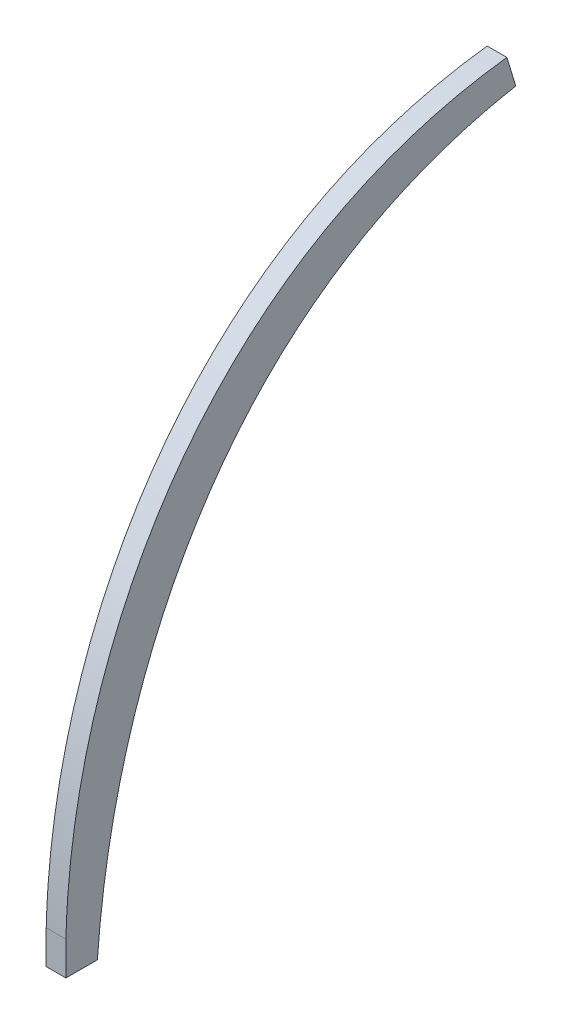
ISO-10303-21;
HEADER;
FILE_DESCRIPTION(('STEP AP214'),'2;1');
FILE_NAME('part.step','',(''),(''),'','','');
FILE_SCHEMA(('AUTOMOTIVE_DESIGN { 1 0 10303 214 1 1 1 1 }'));
ENDSEC;
DATA;
#1=APPLICATION_CONTEXT('core data for automotive mechanical design processes');
#2=APPLICATION_PROTOCOL_DEFINITION('international standard','automotive_design',2000,#1);
#3=PRODUCT_CONTEXT('',#1,'mechanical');
#4=PRODUCT('Part','Part','',(#3));
#5=PRODUCT_RELATED_PRODUCT_CATEGORY('part','',(#4));
#6=PRODUCT_DEFINITION_FORMATION('','',#4);
#7=PRODUCT_DEFINITION_CONTEXT('part definition',#1,'design');
#8=PRODUCT_DEFINITION('design','',#6,#7);
#9=PRODUCT_DEFINITION_SHAPE('','',#8);
#10=(LENGTH_UNIT() NAMED_UNIT(*) SI_UNIT(.MILLI.,.METRE.));
#11=(NAMED_UNIT(*) PLANE_ANGLE_UNIT() SI_UNIT($,.RADIAN.));
#12=(NAMED_UNIT(*) SI_UNIT($,.STERADIAN.) SOLID_ANGLE_UNIT());
#13=UNCERTAINTY_MEASURE_WITH_UNIT(LENGTH_MEASURE(1.E-05),#10,'distance_accuracy_value','');
#14=(GEOMETRIC_REPRESENTATION_CONTEXT(3) GLOBAL_UNCERTAINTY_ASSIGNED_CONTEXT((#13)) GLOBAL_UNIT_ASSIGNED_CONTEXT((#10,
#11,#12)) REPRESENTATION_CONTEXT('',''));
#15=CARTESIAN_POINT('',(0.,0.,0.));
#16=DIRECTION('',(0.,0.,1.));
#17=DIRECTION('',(1.,0.,0.));
#18=AXIS2_PLACEMENT_3D('',#15,#16,#17);
#19=CARTESIAN_POINT('',(4.7625,0.,0.));
#20=DIRECTION('',(1.,0.,0.));
#21=DIRECTION('',(0.,0.,-1.));
#22=AXIS2_PLACEMENT_3D('',#19,#20,#21);
#23=PLANE('',#22);
#24=DIRECTION('',(0.,-0.993368793467325,-0.114971475441832));
#25=VECTOR('',#24,1.);
#26=CARTESIAN_POINT('',(4.7625,139.617065558477,7.61887548022135));
#27=LINE('',#26,#25);
#28=CARTESIAN_POINT('',(4.76249999999993,139.553983208914,7.61157439440986));
#29=VERTEX_POINT('',#28);
#30=CARTESIAN_POINT('',(4.7625,139.490907721706,7.60427410284023));
#31=VERTEX_POINT('',#30);
#32=EDGE_CURVE('E204',#29,#31,#27,.T.);
#33=ORIENTED_EDGE('',*,*,#32,.F.);
#34=CARTESIAN_POINT('',(4.7625,139.7,6.35000000000001));
#35=CARTESIAN_POINT('',(4.7625,131.308423529726,81.9766327472276));
#36=CARTESIAN_POINT('',(4.7625,62.8398866248398,115.82979441628));
#37=CARTESIAN_POINT('',(4.7625,0.,114.3));
#38=B_SPLINE_CURVE_WITH_KNOTS('',3,(#34,#35,#36,#37),.UNSPECIFIED.,.F.,.F.,(4,4),(0.,1.),.UNSPECIFIED.);
#39=CARTESIAN_POINT('',(4.7625,8.15573963729927,114.3));
#40=VERTEX_POINT('',#39);
#41=EDGE_CURVE('E133',#29,#40,#38,.T.);
#42=ORIENTED_EDGE('',*,*,#41,.T.);
#43=DIRECTION('',(0.,-1.,0.));
#44=VECTOR('',#43,1.);
#45=CARTESIAN_POINT('',(4.7625,0.,114.3));
#46=LINE('',#45,#44);
#47=CARTESIAN_POINT('',(4.7625,0.,114.3));
#48=VERTEX_POINT('',#47);
#49=EDGE_CURVE('E130',#40,#48,#46,.T.);
#50=ORIENTED_EDGE('',*,*,#49,.T.);
#51=DIRECTION('',(0.,0.,-1.));
#52=VECTOR('',#51,1.);
#53=CARTESIAN_POINT('',(4.7625,0.,0.));
#54=LINE('',#53,#52);
#55=CARTESIAN_POINT('',(4.7625,0.,106.68));
#56=VERTEX_POINT('',#55);
#57=EDGE_CURVE('E117',#48,#56,#54,.T.);
#58=ORIENTED_EDGE('',*,*,#57,.T.);
#59=CARTESIAN_POINT('',(4.7625,0.,106.68));
#60=CARTESIAN_POINT('',(4.7625,59.703953955578,102.356668146879));
#61=CARTESIAN_POINT('',(4.7625,123.221068249147,72.6720266816524));
#62=CARTESIAN_POINT('',(4.7625,133.35,0.));
#63=B_SPLINE_CURVE_WITH_KNOTS('',3,(#59,#60,#61,#62),.UNSPECIFIED.,.F.,.F.,(4,4),(0.,1.),.UNSPECIFIED.);
#64=CARTESIAN_POINT('',(4.7625,132.474635760667,5.46100087783242));
#65=VERTEX_POINT('',#64);
#66=EDGE_CURVE('E105',#56,#65,#63,.T.);
#67=ORIENTED_EDGE('',*,*,#66,.T.);
#68=DIRECTION('',(0.,-0.956824587352856,-0.290665975024662));
#69=VECTOR('',#68,1.);
#70=CARTESIAN_POINT('',(4.7625,139.553986226189,7.61157836770352));
#71=LINE('',#70,#69);
#72=CARTESIAN_POINT('',(4.7625,139.492233521728,7.59281901485044));
#73=VERTEX_POINT('',#72);
#74=EDGE_CURVE('E55',#73,#65,#71,.T.);
#75=ORIENTED_EDGE('',*,*,#74,.F.);
#76=DIRECTION('',(0.,-0.114971475441836,0.993368793467324));
#77=VECTOR('',#76,1.);
#78=CARTESIAN_POINT('',(4.7625,139.636921081615,6.34269931130946));
#79=LINE('',#78,#77);
#80=EDGE_CURVE('E63',#73,#31,#79,.T.);
#81=ORIENTED_EDGE('',*,*,#80,.T.);
#82=EDGE_LOOP('',(#33,#42,#50,#58,#67,#75,#81));
#83=FACE_BOUND('',#82,.T.);
#84=ADVANCED_FACE('F38',(#83),#23,.T.);
#85=CARTESIAN_POINT('',(0.,0.,0.));
#86=DIRECTION('',(1.,0.,0.));
#87=DIRECTION('',(0.,0.,-1.));
#88=AXIS2_PLACEMENT_3D('',#85,#86,#87);
#89=PLANE('',#88);
#90=CARTESIAN_POINT('',(0.,139.7,6.35000000000001));
#91=CARTESIAN_POINT('',(0.,131.308423529726,81.9766327472276));
#92=CARTESIAN_POINT('',(0.,62.8398866248398,115.82979441628));
#93=CARTESIAN_POINT('',(0.,0.,114.3));
#94=B_SPLINE_CURVE_WITH_KNOTS('',3,(#90,#91,#92,#93),.UNSPECIFIED.,.F.,.F.,(4,4),(0.,1.),.UNSPECIFIED.);
#95=CARTESIAN_POINT('',(0.,139.553986226189,7.61157836770352));
#96=VERTEX_POINT('',#95);
#97=CARTESIAN_POINT('',(0.,8.15573963729927,114.3));
#98=VERTEX_POINT('',#97);
#99=EDGE_CURVE('E140',#96,#98,#94,.T.);
#100=ORIENTED_EDGE('',*,*,#99,.F.);
#101=DIRECTION('',(0.,-0.993368793467325,-0.114971475441832));
#102=VECTOR('',#101,1.);
#103=CARTESIAN_POINT('',(0.,139.617065144574,7.61887905639408));
#104=LINE('',#103,#102);
#105=CARTESIAN_POINT('',(0.,139.490907307804,7.60427767901297));
#106=VERTEX_POINT('',#105);
#107=EDGE_CURVE('E150',#96,#106,#104,.T.);
#108=ORIENTED_EDGE('',*,*,#107,.T.);
#109=DIRECTION('',(0.,0.114971475441832,-0.993368793467325));
#110=VECTOR('',#109,1.);
#111=CARTESIAN_POINT('',(0.,139.490907307804,7.60427767901297));
#112=LINE('',#111,#110);
#113=CARTESIAN_POINT('',(0.,139.492233521728,7.59281901485044));
#114=VERTEX_POINT('',#113);
#115=EDGE_CURVE('E199',#106,#114,#112,.T.);
#116=ORIENTED_EDGE('',*,*,#115,.T.);
#117=DIRECTION('',(0.,-0.956824587352856,-0.290665975024662));
#118=VECTOR('',#117,1.);
#119=CARTESIAN_POINT('',(0.,139.553986226189,7.61157836770352));
#120=LINE('',#119,#118);
#121=CARTESIAN_POINT('',(0.,132.474635920143,5.46099999999998));
#122=VERTEX_POINT('',#121);
#123=EDGE_CURVE('E116',#114,#122,#120,.T.);
#124=ORIENTED_EDGE('',*,*,#123,.T.);
#125=CARTESIAN_POINT('',(0.,0.,106.68));
#126=CARTESIAN_POINT('',(0.,59.703953955578,102.356668146879));
#127=CARTESIAN_POINT('',(0.,123.221068249147,72.6720266816524));
#128=CARTESIAN_POINT('',(0.,133.35,0.));
#129=B_SPLINE_CURVE_WITH_KNOTS('',3,(#125,#126,#127,#128),.UNSPECIFIED.,.F.,.F.,(4,4),(0.,1.),.UNSPECIFIED.);
#130=CARTESIAN_POINT('',(0.,0.,106.68));
#131=VERTEX_POINT('',#130);
#132=EDGE_CURVE('E151',#131,#122,#129,.T.);
#133=ORIENTED_EDGE('',*,*,#132,.F.);
#134=DIRECTION('',(0.,0.,-1.));
#135=VECTOR('',#134,1.);
#136=CARTESIAN_POINT('',(0.,0.,0.));
#137=LINE('',#136,#135);
#138=CARTESIAN_POINT('',(0.,0.,114.3));
#139=VERTEX_POINT('',#138);
#140=EDGE_CURVE('E125',#139,#131,#137,.T.);
#141=ORIENTED_EDGE('',*,*,#140,.F.);
#142=DIRECTION('',(0.,-1.,0.));
#143=VECTOR('',#142,1.);
#144=CARTESIAN_POINT('',(0.,0.,114.3));
#145=LINE('',#144,#143);
#146=EDGE_CURVE('E127',#98,#139,#145,.T.);
#147=ORIENTED_EDGE('',*,*,#146,.F.);
#148=EDGE_LOOP('',(#100,#108,#116,#124,#133,#141,#147));
#149=FACE_BOUND('',#148,.T.);
#150=ADVANCED_FACE('F178',(#149),#89,.F.);
#151=DIRECTION('',(1.,0.,0.));
#152=VECTOR('',#151,1.);
#153=SURFACE_OF_LINEAR_EXTRUSION('',#94,#152);
#154=ORIENTED_EDGE('',*,*,#41,.F.);
#155=CARTESIAN_POINT('',(4.76249999999989,139.553986657017,7.61157479348968));
#156=CARTESIAN_POINT('',(3.17499999999992,139.553986513407,7.6115759848943));
#157=CARTESIAN_POINT('',(1.58749999999996,139.553986369798,7.61157717629891));
#158=CARTESIAN_POINT('',(0.,139.553986226189,7.61157836770352));
#159=B_SPLINE_CURVE_WITH_KNOTS('',3,(#155,#156,#157,#158),.UNSPECIFIED.,.F.,.F.,(4,4),(0.,
4.76250000000125),.UNSPECIFIED.);
#160=EDGE_CURVE('E44',#29,#96,#159,.T.);
#161=ORIENTED_EDGE('',*,*,#160,.T.);
#162=ORIENTED_EDGE('',*,*,#99,.T.);
#163=DIRECTION('',(1.,0.,0.));
#164=VECTOR('',#163,1.);
#165=CARTESIAN_POINT('',(0.,8.15573963729862,114.3));
#166=LINE('',#165,#164);
#167=EDGE_CURVE('E138',#98,#40,#166,.T.);
#168=ORIENTED_EDGE('',*,*,#167,.T.);
#169=EDGE_LOOP('',(#154,#161,#162,#168));
#170=FACE_BOUND('',#169,.T.);
#171=ADVANCED_FACE('F40',(#170),#153,.T.);
#172=CARTESIAN_POINT('',(4.7625,0.,114.3));
#173=DIRECTION('',(0.,0.,-1.));
#174=DIRECTION('',(-1.,0.,0.));
#175=AXIS2_PLACEMENT_3D('',#172,#173,#174);
#176=PLANE('',#175);
#177=ORIENTED_EDGE('',*,*,#167,.F.);
#178=ORIENTED_EDGE('',*,*,#146,.T.);
#179=DIRECTION('',(-1.,0.,0.));
#180=VECTOR('',#179,1.);
#181=CARTESIAN_POINT('',(4.7625,0.,114.3));
#182=LINE('',#181,#180);
#183=EDGE_CURVE('E126',#48,#139,#182,.T.);
#184=ORIENTED_EDGE('',*,*,#183,.F.);
#185=ORIENTED_EDGE('',*,*,#49,.F.);
#186=EDGE_LOOP('',(#177,#178,#184,#185));
#187=FACE_BOUND('',#186,.T.);
#188=ADVANCED_FACE('F186',(#187),#176,.F.);
#189=CARTESIAN_POINT('',(4.7625,0.,0.));
#190=DIRECTION('',(0.,1.,0.));
#191=DIRECTION('',(0.,0.,1.));
#192=AXIS2_PLACEMENT_3D('',#189,#190,#191);
#193=PLANE('',#192);
#194=DIRECTION('',(1.,0.,0.));
#195=VECTOR('',#194,1.);
#196=CARTESIAN_POINT('',(0.,0.,106.68));
#197=LINE('',#196,#195);
#198=EDGE_CURVE('E109',#131,#56,#197,.T.);
#199=ORIENTED_EDGE('',*,*,#198,.T.);
#200=ORIENTED_EDGE('',*,*,#57,.F.);
#201=ORIENTED_EDGE('',*,*,#183,.T.);
#202=ORIENTED_EDGE('',*,*,#140,.T.);
#203=EDGE_LOOP('',(#199,#200,#201,#202));
#204=FACE_BOUND('',#203,.T.);
#205=ADVANCED_FACE('F122',(#204),#193,.F.);
#206=DIRECTION('',(1.,0.,0.));
#207=VECTOR('',#206,1.);
#208=SURFACE_OF_LINEAR_EXTRUSION('',#129,#207);
#209=DIRECTION('',(1.,0.,0.));
#210=VECTOR('',#209,1.);
#211=CARTESIAN_POINT('',(0.,132.474635920143,5.46099999999998));
#212=LINE('',#211,#210);
#213=EDGE_CURVE('E112',#122,#65,#212,.T.);
#214=ORIENTED_EDGE('',*,*,#213,.T.);
#215=ORIENTED_EDGE('',*,*,#66,.F.);
#216=ORIENTED_EDGE('',*,*,#198,.F.);
#217=ORIENTED_EDGE('',*,*,#132,.T.);
#218=EDGE_LOOP('',(#214,#215,#216,#217));
#219=FACE_BOUND('',#218,.T.);
#220=ADVANCED_FACE('F107',(#219),#208,.T.);
#221=CARTESIAN_POINT('',(0.,139.553986226189,7.61157836770352));
#222=DIRECTION('',(0.,-0.290665975024662,0.956824587352855));
#223=DIRECTION('',(0.,-0.956824587352856,-0.290665975024662));
#224=AXIS2_PLACEMENT_3D('',#221,#222,#223);
#225=PLANE('',#224);
#226=ORIENTED_EDGE('',*,*,#123,.F.);
#227=DIRECTION('',(1.,0.,0.));
#228=VECTOR('',#227,1.);
#229=CARTESIAN_POINT('',(0.,139.492233521728,7.59281901485044));
#230=LINE('',#229,#228);
#231=EDGE_CURVE('E12',#114,#73,#230,.T.);
#232=ORIENTED_EDGE('',*,*,#231,.T.);
#233=ORIENTED_EDGE('',*,*,#74,.T.);
#234=ORIENTED_EDGE('',*,*,#213,.F.);
#235=EDGE_LOOP('',(#226,#232,#233,#234));
#236=FACE_BOUND('',#235,.T.);
#237=ADVANCED_FACE('F167',(#236),#225,.F.);
#238=CARTESIAN_POINT('',(4.7625,139.617065558477,7.61887548022135));
#239=DIRECTION('',(7.55915040100415E-07,-0.114971475441799,0.993368793467041));
#240=DIRECTION('',(0.,-0.993368793467325,-0.114971475441832));
#241=AXIS2_PLACEMENT_3D('',#238,#239,#240);
#242=PLANE('',#241);
#243=ORIENTED_EDGE('',*,*,#32,.T.);
#244=DIRECTION('',(-0.999999999999714,-8.69086663235995E-08,7.50902411480923E-07));
#245=VECTOR('',#244,1.);
#246=CARTESIAN_POINT('',(4.7625,139.490907721706,7.60427410284023));
#247=LINE('',#246,#245);
#248=EDGE_CURVE('E201',#31,#106,#247,.T.);
#249=ORIENTED_EDGE('',*,*,#248,.T.);
#250=ORIENTED_EDGE('',*,*,#107,.F.);
#251=ORIENTED_EDGE('',*,*,#160,.F.);
#252=EDGE_LOOP('',(#243,#249,#250,#251));
#253=FACE_BOUND('',#252,.T.);
#254=ADVANCED_FACE('F170',(#253),#242,.F.);
#255=CARTESIAN_POINT('',(0.,138.515532622128,16.0316443015995));
#256=DIRECTION('',(0.,-0.993368793467325,-0.114971475441832));
#257=DIRECTION('',(0.,0.114971475441832,-0.993368793467325));
#258=AXIS2_PLACEMENT_3D('',#255,#256,#257);
#259=PLANE('',#258);
#260=ORIENTED_EDGE('',*,*,#115,.F.);
#261=ORIENTED_EDGE('',*,*,#248,.F.);
#262=ORIENTED_EDGE('',*,*,#80,.F.);
#263=ORIENTED_EDGE('',*,*,#231,.F.);
#264=EDGE_LOOP('',(#260,#261,#262,#263));
#265=FACE_BOUND('',#264,.T.);
#266=ADVANCED_FACE('F175',(#265),#259,.F.);
#267=CLOSED_SHELL('',(#84,#150,#171,#188,#205,#220,#237,#254,#266));
#268=MANIFOLD_SOLID_BREP('B2',#267);
#269=ADVANCED_BREP_SHAPE_REPRESENTATION('',(#18,#268),#14);
#270=SHAPE_DEFINITION_REPRESENTATION(#9,#269);
ENDSEC;
END-ISO-10303-21;
